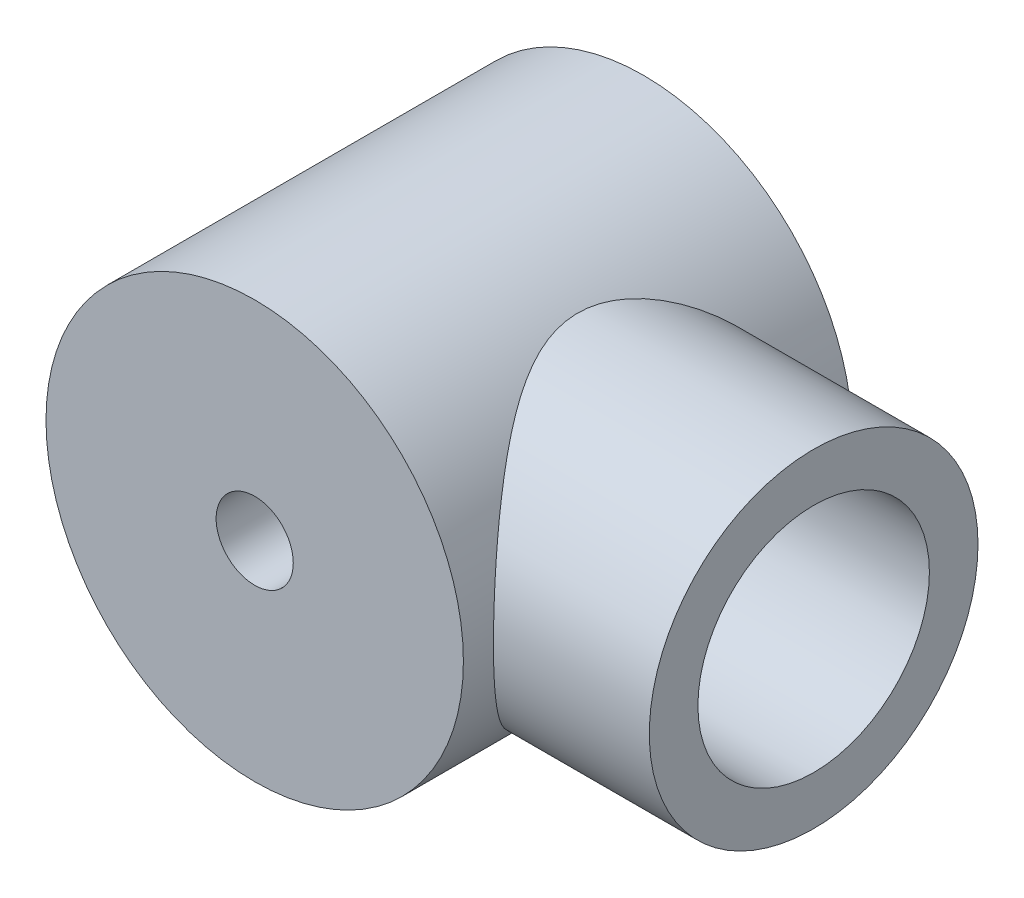
ISO-10303-21;
HEADER;
FILE_DESCRIPTION(('STEP AP214'),'2;1');
FILE_NAME('part.step','',(''),(''),'','','');
FILE_SCHEMA(('AUTOMOTIVE_DESIGN { 1 0 10303 214 1 1 1 1 }'));
ENDSEC;
DATA;
#1=APPLICATION_CONTEXT('core data for automotive mechanical design processes');
#2=APPLICATION_PROTOCOL_DEFINITION('international standard','automotive_design',2000,#1);
#3=PRODUCT_CONTEXT('',#1,'mechanical');
#4=PRODUCT('Part','Part','',(#3));
#5=PRODUCT_RELATED_PRODUCT_CATEGORY('part','',(#4));
#6=PRODUCT_DEFINITION_FORMATION('','',#4);
#7=PRODUCT_DEFINITION_CONTEXT('part definition',#1,'design');
#8=PRODUCT_DEFINITION('design','',#6,#7);
#9=PRODUCT_DEFINITION_SHAPE('','',#8);
#10=(LENGTH_UNIT() NAMED_UNIT(*) SI_UNIT(.MILLI.,.METRE.));
#11=(NAMED_UNIT(*) PLANE_ANGLE_UNIT() SI_UNIT($,.RADIAN.));
#12=(NAMED_UNIT(*) SI_UNIT($,.STERADIAN.) SOLID_ANGLE_UNIT());
#13=UNCERTAINTY_MEASURE_WITH_UNIT(LENGTH_MEASURE(1.E-05),#10,'distance_accuracy_value','');
#14=(GEOMETRIC_REPRESENTATION_CONTEXT(3) GLOBAL_UNCERTAINTY_ASSIGNED_CONTEXT((#13)) GLOBAL_UNIT_ASSIGNED_CONTEXT((#10,
#11,#12)) REPRESENTATION_CONTEXT('',''));
#15=CARTESIAN_POINT('',(0.,0.,0.));
#16=DIRECTION('',(0.,0.,1.));
#17=DIRECTION('',(1.,0.,0.));
#18=AXIS2_PLACEMENT_3D('',#15,#16,#17);
#19=CARTESIAN_POINT('',(0.,0.,-8.));
#20=DIRECTION('',(0.,0.,1.));
#21=DIRECTION('',(1.,0.,0.));
#22=AXIS2_PLACEMENT_3D('',#19,#20,#21);
#23=CYLINDRICAL_SURFACE('',#22,8.5875);
#24=CARTESIAN_POINT('',(0.,0.,-8.));
#25=DIRECTION('',(0.,0.,1.));
#26=DIRECTION('',(1.,0.,0.));
#27=AXIS2_PLACEMENT_3D('',#24,#25,#26);
#28=CIRCLE('',#27,8.5875);
#29=CARTESIAN_POINT('',(8.5875,0.,-8.));
#30=VERTEX_POINT('',#29);
#31=EDGE_CURVE('E60',#30,#30,#28,.T.);
#32=ORIENTED_EDGE('',*,*,#31,.T.);
#33=EDGE_LOOP('',(#32));
#34=FACE_BOUND('',#33,.T.);
#35=CARTESIAN_POINT('',(0.,0.,8.));
#36=DIRECTION('',(0.,0.,1.));
#37=DIRECTION('',(1.,0.,0.));
#38=AXIS2_PLACEMENT_3D('',#35,#36,#37);
#39=CIRCLE('',#38,8.5875);
#40=CARTESIAN_POINT('',(8.5875,0.,8.));
#41=VERTEX_POINT('',#40);
#42=EDGE_CURVE('E169',#41,#41,#39,.T.);
#43=ORIENTED_EDGE('',*,*,#42,.F.);
#44=EDGE_LOOP('',(#43));
#45=FACE_BOUND('',#44,.T.);
#46=CARTESIAN_POINT('',(8.5875,0.,-6.7625));
#47=CARTESIAN_POINT('',(8.58749913450199,-0.163112043237548,-6.76249910952128));
#48=CARTESIAN_POINT('',(8.58284258258308,-0.326238437681878,-6.75658867974146));
#49=CARTESIAN_POINT('',(8.56432259131237,-0.651182409785481,-6.73304710110437));
#50=CARTESIAN_POINT('',(8.55045475119252,-0.812999324408966,-6.71541034989741));
#51=CARTESIAN_POINT('',(8.51380874764045,-1.13418744062865,-6.66868800441926));
#52=CARTESIAN_POINT('',(8.49101751288267,-1.29355469632973,-6.63958561445441));
#53=CARTESIAN_POINT('',(8.43702860361331,-1.60849280329722,-6.57040096090926));
#54=CARTESIAN_POINT('',(8.40582727275956,-1.76406197116328,-6.53031392155735));
#55=CARTESIAN_POINT('',(8.33591220634313,-2.06931583900568,-6.44006929560211));
#56=CARTESIAN_POINT('',(8.29725059797367,-2.21903316951788,-6.38998150744619));
#57=CARTESIAN_POINT('',(8.21302251747412,-2.51293330241193,-6.28022442376314));
#58=CARTESIAN_POINT('',(8.16745303690808,-2.6571136589381,-6.22055095291227));
#59=CARTESIAN_POINT('',(8.02158741456264,-3.08027277844143,-6.02819761643001));
#60=CARTESIAN_POINT('',(7.91206355913889,-3.35016723252305,-5.88209506854118));
#61=CARTESIAN_POINT('',(7.71433048603765,-3.77758764946115,-5.61270919357559));
#62=CARTESIAN_POINT('',(7.63098149426175,-3.94284634797549,-5.49775829786058));
#63=CARTESIAN_POINT('',(7.45820615498423,-4.26063102760147,-5.25531493366235));
#64=CARTESIAN_POINT('',(7.36877792272126,-4.41315302696328,-5.1278185701452));
#65=CARTESIAN_POINT('',(7.18563635613676,-4.7054899836441,-4.8609739026031));
#66=CARTESIAN_POINT('',(7.09191234539941,-4.84527037732922,-4.72159523609139));
#67=CARTESIAN_POINT('',(6.90246867369577,-5.1115325682417,-4.43196691773817));
#68=CARTESIAN_POINT('',(6.80674922981725,-5.23801580314328,-4.28171844409973));
#69=CARTESIAN_POINT('',(6.61413580932432,-5.47928211289791,-3.96844269369884));
#70=CARTESIAN_POINT('',(6.51724513782237,-5.59386693254388,-3.80526061643791));
#71=CARTESIAN_POINT('',(6.32633100602854,-5.80890364550756,-3.46814629904978));
#72=CARTESIAN_POINT('',(6.23230842253847,-5.90935125019636,-3.29421081973044));
#73=CARTESIAN_POINT('',(6.05063469241563,-6.09522844309875,-2.93601324017483));
#74=CARTESIAN_POINT('',(5.96296614266829,-6.18070003711697,-2.75178199953865));
#75=CARTESIAN_POINT('',(5.79776234076226,-6.33592453104775,-2.37264327359999));
#76=CARTESIAN_POINT('',(5.7202185935303,-6.40569064448284,-2.17774493580585));
#77=CARTESIAN_POINT('',(5.56805556983659,-6.53864249117889,-1.74285354632197));
#78=CARTESIAN_POINT('',(5.49620272626052,-6.59866409433995,-1.50084750947978));
#79=CARTESIAN_POINT('',(5.4105948880383,-6.66873080663053,-1.12930679857006));
#80=CARTESIAN_POINT('',(5.38576278385851,-6.68875247562503,-1.0041188100111));
#81=CARTESIAN_POINT('',(5.34443531732408,-6.72182073077273,-0.751486869018815));
#82=CARTESIAN_POINT('',(5.32793598115201,-6.73487064186267,-0.624044021976135));
#83=CARTESIAN_POINT('',(5.30393293837296,-6.75379083176041,-0.366732311253095));
#84=CARTESIAN_POINT('',(5.29650288480873,-6.75960233399217,-0.23685216996732));
#85=CARTESIAN_POINT('',(5.29125602686978,-6.76371036137362,0.0232199075077388));
#86=CARTESIAN_POINT('',(5.29343884799235,-6.76200717928379,0.153411831352959));
#87=CARTESIAN_POINT('',(5.30731037568776,-6.75112498516842,0.413054510199779));
#88=CARTESIAN_POINT('',(5.3190054937024,-6.74194093090804,0.542504705983152));
#89=CARTESIAN_POINT('',(5.35133893095777,-6.71630467851747,0.799601895421015));
#90=CARTESIAN_POINT('',(5.37198198991186,-6.69984862832983,0.927247896341852));
#91=CARTESIAN_POINT('',(5.42563981758645,-6.65649889244587,1.20209737995963));
#92=CARTESIAN_POINT('',(5.46019229856917,-6.62827817049267,1.34879035453527));
#93=CARTESIAN_POINT('',(5.53862610496526,-6.56287866764632,1.63768018939204));
#94=CARTESIAN_POINT('',(5.58251445203624,-6.52569314135442,1.77987357246673));
#95=CARTESIAN_POINT('',(5.67786102727228,-6.44290620714456,2.0595347233208));
#96=CARTESIAN_POINT('',(5.72933618909827,-6.3972859134374,2.19699104859936));
#97=CARTESIAN_POINT('',(5.83804538473802,-6.29823725546676,2.46662519512575));
#98=CARTESIAN_POINT('',(5.89527789552865,-6.24481095448615,2.59880439950271));
#99=CARTESIAN_POINT('',(6.04091345101029,-6.1046561000265,2.9166662613854));
#100=CARTESIAN_POINT('',(6.1316896345411,-6.0138069999145,3.09945365588335));
#101=CARTESIAN_POINT('',(6.31840146450851,-5.81733228068011,3.45415362125783));
#102=CARTESIAN_POINT('',(6.41433926655664,-5.71170045799792,3.62606158237589));
#103=CARTESIAN_POINT('',(6.60837298467058,-5.48604889872762,3.95918952564848));
#104=CARTESIAN_POINT('',(6.70647112267585,-5.36601372405824,4.12039774682076));
#105=CARTESIAN_POINT('',(6.90209976532429,-5.11193566449544,4.43168981200543));
#106=CARTESIAN_POINT('',(6.99963035386763,-4.97789490858008,4.58177534085863));
#107=CARTESIAN_POINT('',(7.19378651286173,-4.69306961658929,4.87328081170988));
#108=CARTESIAN_POINT('',(7.2903530795989,-4.54199939829429,5.01446165842252));
#109=CARTESIAN_POINT('',(7.47820120108284,-4.22557891391568,5.28384866594572));
#110=CARTESIAN_POINT('',(7.56948200325979,-4.06022662270694,5.41205298113432));
#111=CARTESIAN_POINT('',(7.74426021947937,-3.716014395875,5.65391741826036));
#112=CARTESIAN_POINT('',(7.82777549034242,-3.53718725228571,5.76761114366387));
#113=CARTESIAN_POINT('',(7.98496765099718,-3.16637742545957,5.97921164617074));
#114=CARTESIAN_POINT('',(8.05864916244373,-2.97440098676011,6.07712584383352));
#115=CARTESIAN_POINT('',(8.17410611174868,-2.63648304633448,6.22928062038407));
#116=CARTESIAN_POINT('',(8.21890467421711,-2.49353353192052,6.28791189061201));
#117=CARTESIAN_POINT('',(8.30170203871326,-2.20222826409341,6.39575659142382));
#118=CARTESIAN_POINT('',(8.33970252226953,-2.0538738585574,6.44497235117671));
#119=CARTESIAN_POINT('',(8.40817909537395,-1.75257939027227,6.5333379655705));
#120=CARTESIAN_POINT('',(8.4386590856033,-1.59964175108543,6.57249303886158));
#121=CARTESIAN_POINT('',(8.49150164440413,-1.2900438124253,6.64020321678158));
#122=CARTESIAN_POINT('',(8.51386397981726,-1.13338340616296,6.66875801694598));
#123=CARTESIAN_POINT('',(8.55006443647259,-0.816737743924128,6.71491311634784));
#124=CARTESIAN_POINT('',(8.56386332421129,-0.656740606326983,6.73246300024504));
#125=CARTESIAN_POINT('',(8.58245777430414,-0.335377222676936,6.75609982955228));
#126=CARTESIAN_POINT('',(8.58725335785356,-0.174010979848032,6.76218680194792));
#127=CARTESIAN_POINT('',(8.58772806488527,0.148749773309905,6.76278960732639));
#128=CARTESIAN_POINT('',(8.58340753254853,0.3101442823417,6.75730587716365));
#129=CARTESIAN_POINT('',(8.56575242641335,0.631629417689947,6.73486545654116));
#130=CARTESIAN_POINT('',(8.55241819179976,0.791720092840154,6.71790919779167));
#131=CARTESIAN_POINT('',(8.5182745224411,1.09830553053107,6.67438526234607));
#132=CARTESIAN_POINT('',(8.49804793330376,1.2449729390842,6.64856608567238));
#133=CARTESIAN_POINT('',(8.45043720825167,1.53522065296745,6.58760211337653));
#134=CARTESIAN_POINT('',(8.42305064428142,1.67879989314281,6.55245415416189));
#135=CARTESIAN_POINT('',(8.36162306642033,1.96199032700115,6.47330001114597));
#136=CARTESIAN_POINT('',(8.32758359735308,2.10160243326037,6.42929588370192));
#137=CARTESIAN_POINT('',(8.2534029104338,2.37628897189325,6.33291840578578));
#138=CARTESIAN_POINT('',(8.21325933668777,2.51136162757173,6.28054182354264));
#139=CARTESIAN_POINT('',(8.12429519230187,2.78628346148602,6.1637619270824));
#140=CARTESIAN_POINT('',(8.07505096772139,2.92573866386686,6.098753286013));
#141=CARTESIAN_POINT('',(7.97103612853061,3.19828892611057,5.96034747207931));
#142=CARTESIAN_POINT('',(7.91626360383533,3.33138176414381,5.88694739871795));
#143=CARTESIAN_POINT('',(7.74484037278359,3.72059548587264,5.65506133671167));
#144=CARTESIAN_POINT('',(7.62104475367985,3.96676949520048,5.48483868342502));
#145=CARTESIAN_POINT('',(7.41355925446012,4.33700182872603,5.19163519312762));
#146=CARTESIAN_POINT('',(7.33379022247254,4.47032009622501,5.07722833477888));
#147=CARTESIAN_POINT('',(7.17121143490149,4.72672029341569,4.83942801088657));
#148=CARTESIAN_POINT('',(7.08840201003652,4.84980333171634,4.71603552132688));
#149=CARTESIAN_POINT('',(6.92104924798641,5.08578424713459,4.46055015015701));
#150=CARTESIAN_POINT('',(6.83650337339285,5.19866569172919,4.3284438042637));
#151=CARTESIAN_POINT('',(6.66735750184193,5.41389132685487,4.05602150558343));
#152=CARTESIAN_POINT('',(6.58275753046491,5.51623883931614,3.91570816294164));
#153=CARTESIAN_POINT('',(6.41660434495859,5.70860951497731,3.62938381976867));
#154=CARTESIAN_POINT('',(6.33502380577744,5.79881160831661,3.48350904340367));
#155=CARTESIAN_POINT('',(6.17531598327262,5.96860201450041,3.18384437713263));
#156=CARTESIAN_POINT('',(6.09718926315303,6.0481886005425,3.03005320510832));
#157=CARTESIAN_POINT('',(5.94678744291215,6.19612641245526,2.71471615601477));
#158=CARTESIAN_POINT('',(5.87450301323638,6.26449573852634,2.55318332623085));
#159=CARTESIAN_POINT('',(5.73841869209368,6.38938408059264,2.2222695828217));
#160=CARTESIAN_POINT('',(5.67461451966992,6.44590908414673,2.05289268767426));
#161=CARTESIAN_POINT('',(5.53790540676052,6.5641178597782,1.64425224119166));
#162=CARTESIAN_POINT('',(5.4698956666413,6.62042728790569,1.4016434376779));
#163=CARTESIAN_POINT('',(5.39067987179127,6.68482392386418,1.0297527566037));
#164=CARTESIAN_POINT('',(5.3680806317642,6.70294039202688,0.904531237091344));
#165=CARTESIAN_POINT('',(5.33135833952012,6.73218635528499,0.652065792014625));
#166=CARTESIAN_POINT('',(5.31723121989549,6.74331920328742,0.524822867081185));
#167=CARTESIAN_POINT('',(5.29804476466162,6.75840442048426,0.268325941076616));
#168=CARTESIAN_POINT('',(5.29304965856458,6.76230593109712,0.139064095825136));
#169=CARTESIAN_POINT('',(5.29257187894532,6.76267989854074,-0.119485837794347));
#170=CARTESIAN_POINT('',(5.29708896340842,6.759152544381,-0.248773925410993));
#171=CARTESIAN_POINT('',(5.31541549843665,6.74474963399044,-0.506375710360017));
#172=CARTESIAN_POINT('',(5.32923266479868,6.73386797624354,-0.634688509082128));
#173=CARTESIAN_POINT('',(5.3655139753675,6.70499430155844,-0.88932123233993));
#174=CARTESIAN_POINT('',(5.38798277265095,6.68699845828331,-1.01564004633512));
#175=CARTESIAN_POINT('',(5.44611233666464,6.63978126885757,-1.29158040838576));
#176=CARTESIAN_POINT('',(5.48354798495935,6.60900062951092,-1.44056054203455));
#177=CARTESIAN_POINT('',(5.56773548506076,6.53823324929153,-1.73368998028042));
#178=CARTESIAN_POINT('',(5.6144945972654,6.49823933002957,-1.87783541714749));
#179=CARTESIAN_POINT('',(5.71547288805906,6.40960564048464,-2.16112030710538));
#180=CARTESIAN_POINT('',(5.76970876694019,6.36094644216222,-2.30024764846762));
#181=CARTESIAN_POINT('',(5.88375900849463,6.25560276173973,-2.57297625230045));
#182=CARTESIAN_POINT('',(5.94357180445325,6.19892053123339,-2.70657905163874));
#183=CARTESIAN_POINT('',(6.09446222472643,6.05129549351649,-3.02594822667402));
#184=CARTESIAN_POINT('',(6.18771629533855,5.95625194691936,-3.2088000919301));
#185=CARTESIAN_POINT('',(6.37880338031622,5.75114777689259,-3.563379522074));
#186=CARTESIAN_POINT('',(6.47663821733447,5.64108114195035,-3.73510259298203));
#187=CARTESIAN_POINT('',(6.67388960414344,5.40628248230607,-4.0675496468049));
#188=CARTESIAN_POINT('',(6.77330760749722,5.28153621778691,-4.22826270652347));
#189=CARTESIAN_POINT('',(6.97099239015595,5.01772795868508,-4.53819509730367));
#190=CARTESIAN_POINT('',(7.06925934109318,4.87866812944487,-4.68741616091006));
#191=CARTESIAN_POINT('',(7.26382531913731,4.58406492257812,-4.97603655530657));
#192=CARTESIAN_POINT('',(7.36006889710434,4.42829623824863,-5.11524395399071));
#193=CARTESIAN_POINT('',(7.54661766696012,4.10231456535621,-5.38019811933773));
#194=CARTESIAN_POINT('',(7.63692194092399,3.93209935333658,-5.50594280720296));
#195=CARTESIAN_POINT('',(7.80905357483028,3.57805813794085,-5.74230859852382));
#196=CARTESIAN_POINT('',(7.89089922721514,3.39426304490388,-5.85296251008127));
#197=CARTESIAN_POINT('',(8.04398039713277,3.01356314009422,-6.05776327147086));
#198=CARTESIAN_POINT('',(8.11522173929703,2.8166656117473,-6.15191918823236));
#199=CARTESIAN_POINT('',(8.22471393198968,2.4740302378085,-6.2955221687647));
#200=CARTESIAN_POINT('',(8.26634380889814,2.33136573078659,-6.34977847434103));
#201=CARTESIAN_POINT('',(8.34276580881686,2.04105953626545,-6.44895280231337));
#202=CARTESIAN_POINT('',(8.37755966354332,1.89341912040561,-6.49387318987185));
#203=CARTESIAN_POINT('',(8.43960049773383,1.59423757144986,-6.57371556606062));
#204=CARTESIAN_POINT('',(8.46686276733827,1.44270503414929,-6.60865781659288));
#205=CARTESIAN_POINT('',(8.51337786735793,1.1364523861726,-6.66814797438525));
#206=CARTESIAN_POINT('',(8.53263394975727,0.981733596554878,-6.6927001020181));
#207=CARTESIAN_POINT('',(8.56088152002121,0.689411410463834,-6.72867366025587));
#208=CARTESIAN_POINT('',(8.57084699356979,0.552054098804223,-6.74134226553188));
#209=CARTESIAN_POINT('',(8.58415740670405,0.276468096828647,-6.75825683863165));
#210=CARTESIAN_POINT('',(8.58750073351882,0.138239202466487,-6.76250075469024));
#211=CARTESIAN_POINT('',(8.5875,0.,-6.7625));
#212=B_SPLINE_CURVE_WITH_KNOTS('',3,(#46,#47,#48,#49,#50,#51,#52,#53,#54,#55,#56,#57,#58,#59,
#60,#61,#62,#63,#64,#65,#66,#67,#68,#69,#70,#71,#72,#73,#74,#75,#76,#77,#78,#79,#80,#81,#82,#83,
#84,#85,#86,#87,#88,#89,#90,#91,#92,#93,#94,#95,#96,#97,#98,#99,#100,#101,#102,#103,#104,#105,
#106,#107,#108,#109,#110,#111,#112,#113,#114,#115,#116,#117,#118,#119,#120,#121,#122,#123,#124,
#125,#126,#127,#128,#129,#130,#131,#132,#133,#134,#135,#136,#137,#138,#139,#140,#141,#142,#143,
#144,#145,#146,#147,#148,#149,#150,#151,#152,#153,#154,#155,#156,#157,#158,#159,#160,#161,#162,
#163,#164,#165,#166,#167,#168,#169,#170,#171,#172,#173,#174,#175,#176,#177,#178,#179,#180,#181,
#182,#183,#184,#185,#186,#187,#188,#189,#190,#191,#192,#193,#194,#195,#196,#197,#198,#199,#200,
#201,#202,#203,#204,#205,#206,#207,#208,#209,#210,#211),.UNSPECIFIED.,.T.,.F.,(4,2,2,2,2,2,2,2,
2,2,2,2,2,2,2,2,2,2,2,2,2,2,2,2,2,2,2,2,2,2,2,2,2,2,2,2,2,2,2,2,2,2,2,2,2,2,2,2,2,2,2,2,2,2,2,2,
2,2,2,2,2,2,2,2,2,2,2,2,2,2,2,2,2,2,2,2,2,2,2,2,2,2,4),(0.,0.489189244579093,0.978612371576191,
1.46875512258399,1.95911131090346,2.4461577895962,2.9334169937366,3.90698924993781,
4.55991560905964,5.21304532793188,5.86789708696919,6.52267797118023,7.18703871578309,
7.85160056673394,8.51426748050667,9.17637477028301,9.95167748151299,10.3388454434372,
10.7258285938997,11.1159340212858,11.5060242509029,11.8963776257358,12.2869380234357,
12.7462164568928,13.205841550304,13.6665085075091,14.1270539208252,14.7962817615387,
15.4657912901519,16.1360249455138,16.8061568669644,17.4899530318968,18.1738463153133,
18.856125943386,19.5380837770198,20.0202357785508,20.5022683527007,20.9840503812197,
21.4658462465703,21.9498334756385,22.4338195653193,22.9177873823257,23.4017369886777,
23.8521085750988,24.3026330878711,24.7530531115835,25.2036474193235,25.6878151059947,
26.1721506540204,27.1404225000776,27.7188390446972,28.2971928574281,28.8764622578647,
29.4555484193368,30.0248558550038,30.5942557860753,31.1627276981351,31.7309115384446,
32.5021301047279,32.8873125880384,33.2723099994994,33.6600050020453,34.0476901407483,
34.4356973188671,34.8239134696781,35.293187153706,35.762827709368,36.2335347953209,
36.7041100424073,37.3817454636999,38.0596528412059,38.7382233220416,39.416691299832,
40.1058555960634,40.7951261541909,41.4828734655536,42.1702416126955,42.6444191801153,
43.1184764725122,43.5915641711839,44.0644595210896,44.4789517079129,44.8935448285896),.UNSPECIFIED.);
#213=CARTESIAN_POINT('',(8.5875,0.,-6.7625));
#214=VERTEX_POINT('',#213);
#215=EDGE_CURVE('E79',#214,#214,#212,.T.);
#216=ORIENTED_EDGE('',*,*,#215,.T.);
#217=EDGE_LOOP('',(#216));
#218=FACE_BOUND('',#217,.T.);
#219=ADVANCED_FACE('F55',(#34,#45,#218),#23,.T.);
#220=CARTESIAN_POINT('',(0.,0.,-8.));
#221=DIRECTION('',(0.,0.,1.));
#222=DIRECTION('',(1.,0.,0.));
#223=AXIS2_PLACEMENT_3D('',#220,#221,#222);
#224=CYLINDRICAL_SURFACE('',#223,1.5875);
#225=CARTESIAN_POINT('',(0.,0.,-8.));
#226=DIRECTION('',(0.,0.,1.));
#227=DIRECTION('',(1.,0.,0.));
#228=AXIS2_PLACEMENT_3D('',#225,#226,#227);
#229=CIRCLE('',#228,1.5875);
#230=CARTESIAN_POINT('',(1.5875,0.,-8.));
#231=VERTEX_POINT('',#230);
#232=EDGE_CURVE('E70',#231,#231,#229,.T.);
#233=ORIENTED_EDGE('',*,*,#232,.F.);
#234=EDGE_LOOP('',(#233));
#235=FACE_BOUND('',#234,.T.);
#236=CARTESIAN_POINT('',(0.,0.,8.));
#237=DIRECTION('',(0.,0.,1.));
#238=DIRECTION('',(1.,0.,0.));
#239=AXIS2_PLACEMENT_3D('',#236,#237,#238);
#240=CIRCLE('',#239,1.5875);
#241=CARTESIAN_POINT('',(1.5875,0.,8.));
#242=VERTEX_POINT('',#241);
#243=EDGE_CURVE('E173',#242,#242,#240,.T.);
#244=ORIENTED_EDGE('',*,*,#243,.T.);
#245=EDGE_LOOP('',(#244));
#246=FACE_BOUND('',#245,.T.);
#247=ADVANCED_FACE('F102',(#235,#246),#224,.F.);
#248=CARTESIAN_POINT('',(0.,0.,-8.));
#249=DIRECTION('',(0.,0.,1.));
#250=DIRECTION('',(1.,0.,0.));
#251=AXIS2_PLACEMENT_3D('',#248,#249,#250);
#252=PLANE('',#251);
#253=ORIENTED_EDGE('',*,*,#232,.T.);
#254=EDGE_LOOP('',(#253));
#255=FACE_BOUND('',#254,.T.);
#256=ORIENTED_EDGE('',*,*,#31,.F.);
#257=EDGE_LOOP('',(#256));
#258=FACE_BOUND('',#257,.T.);
#259=ADVANCED_FACE('F100',(#255,#258),#252,.F.);
#260=CARTESIAN_POINT('',(0.,0.,8.));
#261=DIRECTION('',(0.,0.,1.));
#262=DIRECTION('',(1.,0.,0.));
#263=AXIS2_PLACEMENT_3D('',#260,#261,#262);
#264=PLANE('',#263);
#265=ORIENTED_EDGE('',*,*,#42,.T.);
#266=EDGE_LOOP('',(#265));
#267=FACE_BOUND('',#266,.T.);
#268=ORIENTED_EDGE('',*,*,#243,.F.);
#269=EDGE_LOOP('',(#268));
#270=FACE_BOUND('',#269,.T.);
#271=ADVANCED_FACE('F92',(#267,#270),#264,.T.);
#272=CARTESIAN_POINT('',(15.,0.,0.));
#273=DIRECTION('',(1.,0.,0.));
#274=DIRECTION('',(0.,0.,-1.));
#275=AXIS2_PLACEMENT_3D('',#272,#273,#274);
#276=PLANE('',#275);
#277=CARTESIAN_POINT('',(15.,0.,0.));
#278=DIRECTION('',(1.,0.,0.));
#279=DIRECTION('',(0.,0.,-1.));
#280=AXIS2_PLACEMENT_3D('',#277,#278,#279);
#281=CIRCLE('',#280,6.7625);
#282=CARTESIAN_POINT('',(15.,0.,-6.7625));
#283=VERTEX_POINT('',#282);
#284=EDGE_CURVE('E77',#283,#283,#281,.T.);
#285=ORIENTED_EDGE('',*,*,#284,.T.);
#286=EDGE_LOOP('',(#285));
#287=FACE_BOUND('',#286,.T.);
#288=CARTESIAN_POINT('',(15.,0.,0.));
#289=DIRECTION('',(1.,0.,0.));
#290=DIRECTION('',(0.,0.,-1.));
#291=AXIS2_PLACEMENT_3D('',#288,#289,#290);
#292=CIRCLE('',#291,4.7625);
#293=CARTESIAN_POINT('',(15.,0.,-4.7625));
#294=VERTEX_POINT('',#293);
#295=EDGE_CURVE('E178',#294,#294,#292,.T.);
#296=ORIENTED_EDGE('',*,*,#295,.F.);
#297=EDGE_LOOP('',(#296));
#298=FACE_BOUND('',#297,.T.);
#299=ADVANCED_FACE('F90',(#287,#298),#276,.T.);
#300=CARTESIAN_POINT('',(15.,0.,0.));
#301=DIRECTION('',(-1.,0.,0.));
#302=DIRECTION('',(0.,0.,1.));
#303=AXIS2_PLACEMENT_3D('',#300,#301,#302);
#304=CYLINDRICAL_SURFACE('',#303,6.7625);
#305=ORIENTED_EDGE('',*,*,#215,.F.);
#306=EDGE_LOOP('',(#305));
#307=FACE_BOUND('',#306,.T.);
#308=ORIENTED_EDGE('',*,*,#284,.F.);
#309=EDGE_LOOP('',(#308));
#310=FACE_BOUND('',#309,.T.);
#311=ADVANCED_FACE('F89',(#307,#310),#304,.T.);
#312=CARTESIAN_POINT('',(15.,0.,0.));
#313=DIRECTION('',(-1.,0.,0.));
#314=DIRECTION('',(0.,0.,1.));
#315=AXIS2_PLACEMENT_3D('',#312,#313,#314);
#316=CYLINDRICAL_SURFACE('',#315,4.7625);
#317=CARTESIAN_POINT('',(8.5875,0.,-4.7625));
#318=CARTESIAN_POINT('',(8.58750136624759,-0.123540662729897,-4.76250153706124));
#319=CARTESIAN_POINT('',(8.5848290668004,-0.247063815025433,-4.75768870660874));
#320=CARTESIAN_POINT('',(8.57421128964902,-0.493178741735023,-4.73850347528329));
#321=CARTESIAN_POINT('',(8.56626432944852,-0.615770244499117,-4.72412838683928));
#322=CARTESIAN_POINT('',(8.54528833733139,-0.859150223121152,-4.68598503648981));
#323=CARTESIAN_POINT('',(8.53225468219542,-0.97993695466138,-4.66220822924598));
#324=CARTESIAN_POINT('',(8.50142584201441,-1.21877921714014,-4.60554620212321));
#325=CARTESIAN_POINT('',(8.48362871274451,-1.33683361144407,-4.57265726290995));
#326=CARTESIAN_POINT('',(8.44379173907492,-1.56886117286086,-4.49831639834476));
#327=CARTESIAN_POINT('',(8.42177181356869,-1.68285063313127,-4.45690461060071));
#328=CARTESIAN_POINT('',(8.3739379354894,-1.9066840225184,-4.3658424654971));
#329=CARTESIAN_POINT('',(8.3481225472735,-2.01652636313106,-4.31618898977881));
#330=CARTESIAN_POINT('',(8.26582710402402,-2.33886678002069,-4.15555767393931));
#331=CARTESIAN_POINT('',(8.20445776783941,-2.54440166346567,-4.03283648633992));
#332=CARTESIAN_POINT('',(8.06913589158275,-2.9465900913618,-3.75015256897967));
#333=CARTESIAN_POINT('',(7.9946051697665,-3.14163287396523,-3.58819393600173));
#334=CARTESIAN_POINT('',(7.84285627377938,-3.50332311559721,-3.23604119115127));
#335=CARTESIAN_POINT('',(7.76563562626801,-3.66994356397729,-3.04582053857853));
#336=CARTESIAN_POINT('',(7.60808766181872,-3.98704947352266,-2.61957460330507));
#337=CARTESIAN_POINT('',(7.52822914360619,-4.13422617956411,-2.38086658001207));
#338=CARTESIAN_POINT('',(7.42049252494249,-4.3228138019861,-2.00362344505267));
#339=CARTESIAN_POINT('',(7.38657966137506,-4.38032707544095,-1.87463322904761));
#340=CARTESIAN_POINT('',(7.3241071860546,-4.48400129670014,-1.61095245410247));
#341=CARTESIAN_POINT('',(7.2955440841782,-4.53016965197688,-1.47626568233971));
#342=CARTESIAN_POINT('',(7.24663153859961,-4.60797902368908,-1.21072945715671));
#343=CARTESIAN_POINT('',(7.22587988088969,-4.64034847403472,-1.08016751114982));
#344=CARTESIAN_POINT('',(7.19113508341906,-4.69401302174334,-0.815965522820267));
#345=CARTESIAN_POINT('',(7.17713791101275,-4.715314727491,-0.682327367155135));
#346=CARTESIAN_POINT('',(7.15657645216841,-4.74646404547198,-0.413285461803441));
#347=CARTESIAN_POINT('',(7.15000473314203,-4.75632311160914,-0.277883615110478));
#348=CARTESIAN_POINT('',(7.14460699080766,-4.76442794524967,-0.00658837758861104));
#349=CARTESIAN_POINT('',(7.14577987168481,-4.76267535573318,0.129304940980504));
#350=CARTESIAN_POINT('',(7.15502277962899,-4.74877422437525,0.379023417739793));
#351=CARTESIAN_POINT('',(7.16198905285236,-4.73828898089656,0.492986190867628));
#352=CARTESIAN_POINT('',(7.18112737497093,-4.70923112429649,0.71944478579291));
#353=CARTESIAN_POINT('',(7.19330100260904,-4.69065605850718,0.831940152041095));
#354=CARTESIAN_POINT('',(7.23705234837445,-4.62311498653135,1.16608046294158));
#355=CARTESIAN_POINT('',(7.27586624342261,-4.56232529501711,1.38451375897434));
#356=CARTESIAN_POINT('',(7.36905011105366,-4.41024675988994,1.81214141595742));
#357=CARTESIAN_POINT('',(7.42373300895122,-4.31833748935018,2.0210409656501));
#358=CARTESIAN_POINT('',(7.5426231857091,-4.10714809033425,2.42157287678296));
#359=CARTESIAN_POINT('',(7.60683453057146,-3.98785626516509,2.61319781036525));
#360=CARTESIAN_POINT('',(7.74995407890935,-3.7030621785492,3.006118562774));
#361=CARTESIAN_POINT('',(7.82956484279359,-3.53321323214197,3.20401115183112));
#362=CARTESIAN_POINT('',(7.9863992325728,-3.16274862973515,3.57018397727733));
#363=CARTESIAN_POINT('',(8.06362114329999,-2.96211145719911,3.73844332630599));
#364=CARTESIAN_POINT('',(8.17464385436158,-2.63344812587389,3.97065077480336));
#365=CARTESIAN_POINT('',(8.2119463248493,-2.51500784829611,4.04673672026047));
#366=CARTESIAN_POINT('',(8.28273931046276,-2.27101041524183,4.18853220066486));
#367=CARTESIAN_POINT('',(8.31623145393023,-2.14545633447093,4.25424617275665));
#368=CARTESIAN_POINT('',(8.3784169290999,-1.88807070616978,4.37455934275679));
#369=CARTESIAN_POINT('',(8.40711271185005,-1.75624240942903,4.42916422077904));
#370=CARTESIAN_POINT('',(8.45884506053156,-1.48722694052792,4.52658988364433));
#371=CARTESIAN_POINT('',(8.48188244616244,-1.35004054790535,4.56941237544226));
#372=CARTESIAN_POINT('',(8.51968810858967,-1.08458408541675,4.6391928502019));
#373=CARTESIAN_POINT('',(8.53502999133984,-0.956687495089182,4.66726345567216));
#374=CARTESIAN_POINT('',(8.56002903320478,-0.698480758953909,4.71282412665362));
#375=CARTESIAN_POINT('',(8.56968685921998,-0.56817089814224,4.73031543342211));
#376=CARTESIAN_POINT('',(8.58303596240136,-0.306314561016899,4.75445658218817));
#377=CARTESIAN_POINT('',(8.58673034544723,-0.174768764335044,4.76111206771248));
#378=CARTESIAN_POINT('',(8.58805273326348,0.0884484319938167,4.76349678518266));
#379=CARTESIAN_POINT('',(8.58568114406697,0.220119822644303,4.7592267484414));
#380=CARTESIAN_POINT('',(8.57548224670657,0.46927609474965,4.74080115879345));
#381=CARTESIAN_POINT('',(8.56822445592111,0.586862442709509,4.72767727366646));
#382=CARTESIAN_POINT('',(8.54902565926909,0.820394994931048,4.69279253977324));
#383=CARTESIAN_POINT('',(8.53708320257958,0.936340679549277,4.67102901531898));
#384=CARTESIAN_POINT('',(8.50879108657965,1.1657522600104,4.61911793072229));
#385=CARTESIAN_POINT('',(8.49244283114076,1.27921893334073,4.58897304113614));
#386=CARTESIAN_POINT('',(8.45570327948678,1.50304065830958,4.52061841957201));
#387=CARTESIAN_POINT('',(8.43531042224729,1.61339448969653,4.48240557337699));
#388=CARTESIAN_POINT('',(8.36774195407376,1.94345869743708,4.35439351000889));
#389=CARTESIAN_POINT('',(8.31479053510796,2.15737721408968,4.25231356422446));
#390=CARTESIAN_POINT('',(8.19809292332133,2.56547203334984,4.01934407477641));
#391=CARTESIAN_POINT('',(8.13434286717948,2.75964123051039,3.88844421545711));
#392=CARTESIAN_POINT('',(7.99330871428637,3.14628379503722,3.58459764224653));
#393=CARTESIAN_POINT('',(7.91530934340972,3.33608369206208,3.40857041235044));
#394=CARTESIAN_POINT('',(7.75907628039874,3.68490345290034,3.02814962643646));
#395=CARTESIAN_POINT('',(7.68084242708293,3.84389027572443,2.82372601956355));
#396=CARTESIAN_POINT('',(7.5260572779972,4.13927924259841,2.37194842063636));
#397=CARTESIAN_POINT('',(7.45015032249566,4.27282657036672,2.12246190656135));
#398=CARTESIAN_POINT('',(7.35135335389961,4.43924888144807,1.73051243076991));
#399=CARTESIAN_POINT('',(7.32093333399797,4.48907072668797,1.5969200594317));
#400=CARTESIAN_POINT('',(7.26639805710805,4.57682072911148,1.32459275508252));
#401=CARTESIAN_POINT('',(7.24228160872218,4.61475113409054,1.18585879951725));
#402=CARTESIAN_POINT('',(7.20352030054756,4.67499832708322,0.918035360380329));
#403=CARTESIAN_POINT('',(7.18818701389532,4.69846688506215,0.789303553126146));
#404=CARTESIAN_POINT('',(7.16433354655907,4.73476048367148,0.529728824451591));
#405=CARTESIAN_POINT('',(7.15581222850352,4.74758730113111,0.398886259180796));
#406=CARTESIAN_POINT('',(7.14598993443779,4.76235906519753,0.136412832171398));
#407=CARTESIAN_POINT('',(7.14468366731813,4.76431198611234,0.00478261898642908));
#408=CARTESIAN_POINT('',(7.14934111193058,4.75732025993159,-0.258050010232938));
#409=CARTESIAN_POINT('',(7.1553041868062,4.74837656747257,-0.38925246273318));
#410=CARTESIAN_POINT('',(7.17287880612158,4.72177681706349,-0.631609483566777));
#411=CARTESIAN_POINT('',(7.18357771154315,4.70552341489809,-0.742987783336697));
#412=CARTESIAN_POINT('',(7.2097565799233,4.66531181863331,-0.963784619461231));
#413=CARTESIAN_POINT('',(7.22523796221863,4.64135133715062,-1.07320256381154));
#414=CARTESIAN_POINT('',(7.27814873198192,4.55829717018313,-1.39751638641542));
#415=CARTESIAN_POINT('',(7.32205492354706,4.48801632231451,-1.60860038924542));
#416=CARTESIAN_POINT('',(7.42527656308573,4.31521401399975,-2.02856193741922));
#417=CARTESIAN_POINT('',(7.48535985559997,4.21100795447503,-2.23654351718243));
#418=CARTESIAN_POINT('',(7.61339071878975,3.97485523061696,-2.6334943603424));
#419=CARTESIAN_POINT('',(7.68134242000931,3.84289396616317,-2.82245353969082));
#420=CARTESIAN_POINT('',(7.83044989594184,3.53040790302892,-3.20758875692344));
#421=CARTESIAN_POINT('',(7.91197626097728,3.3454893096614,-3.40006658278203));
#422=CARTESIAN_POINT('',(8.0697703433511,2.94453456232952,-3.75264091424402));
#423=CARTESIAN_POINT('',(8.14603414639551,2.7284756073478,-3.91271348434769));
#424=CARTESIAN_POINT('',(8.2520498799888,2.38000483067563,-4.12754342047428));
#425=CARTESIAN_POINT('',(8.2865469058704,2.25726603090946,-4.19595429669132));
#426=CARTESIAN_POINT('',(8.35109562207614,2.00530081879664,-4.3220354237203));
#427=CARTESIAN_POINT('',(8.38114948795087,1.87607762326639,-4.37971093460802));
#428=CARTESIAN_POINT('',(8.43586790616153,1.61226740203457,-4.48353192823159));
#429=CARTESIAN_POINT('',(8.46054256929939,1.47769101146714,-4.5296990660723));
#430=CARTESIAN_POINT('',(8.50379125341409,1.20409998745815,-4.60997390659743));
#431=CARTESIAN_POINT('',(8.52236841258075,1.06508767759206,-4.64408781338692));
#432=CARTESIAN_POINT('',(8.55400394463343,0.772914235497976,-4.70190045971597));
#433=CARTESIAN_POINT('',(8.5665223880444,0.619492080669483,-4.72458592212));
#434=CARTESIAN_POINT('',(8.58326945354422,0.310704023457541,-4.75488453822636));
#435=CARTESIAN_POINT('',(8.58749828210084,0.155338169582415,-4.76249806732234));
#436=CARTESIAN_POINT('',(8.5875,0.,-4.7625));
#437=B_SPLINE_CURVE_WITH_KNOTS('',3,(#317,#318,#319,#320,#321,#322,#323,#324,#325,#326,#327,
#328,#329,#330,#331,#332,#333,#334,#335,#336,#337,#338,#339,#340,#341,#342,#343,#344,#345,#346,
#347,#348,#349,#350,#351,#352,#353,#354,#355,#356,#357,#358,#359,#360,#361,#362,#363,#364,#365,
#366,#367,#368,#369,#370,#371,#372,#373,#374,#375,#376,#377,#378,#379,#380,#381,#382,#383,#384,
#385,#386,#387,#388,#389,#390,#391,#392,#393,#394,#395,#396,#397,#398,#399,#400,#401,#402,#403,
#404,#405,#406,#407,#408,#409,#410,#411,#412,#413,#414,#415,#416,#417,#418,#419,#420,#421,#422,
#423,#424,#425,#426,#427,#428,#429,#430,#431,#432,#433,#434,#435,#436),.UNSPECIFIED.,.T.,.F.,(4,
2,2,2,2,2,2,2,2,2,2,2,2,2,2,2,2,2,2,2,2,2,2,2,2,2,2,2,2,2,2,2,2,2,2,2,2,2,2,2,2,2,2,2,2,2,2,2,2,
2,2,2,2,2,2,2,2,2,2,4),(0.,0.370470046793782,0.741044262028311,1.11195607383622,
1.48301950577217,1.85237387197696,2.22186830851138,2.96015053607059,3.74975764783029,
4.54011101763388,5.40996305744714,5.84517590070114,6.28010381949041,6.68780797514852,
7.09526841619185,7.50232064296155,7.90931527549466,8.25286044757009,8.59650984806975,
9.2834102689086,9.98490167146554,10.6866932815534,11.5013806682007,12.3166400189948,
12.7530382798359,13.1892493399028,13.6252368002505,14.0611610642952,14.4561230493927,
14.8510386850484,15.2457485743479,15.640432043961,15.9956318861233,16.3509418192643,
16.7061386694076,17.061472876393,17.7868388401686,18.5124648611313,19.3201263364022,
20.1286491360509,21.0023666330277,21.4391595344064,21.8758698205695,22.2705284031649,
22.6651210771705,23.0594243408116,23.4536930625981,23.7924961722408,24.1313999281484,
24.8088239386502,25.5269837235465,26.2455222323964,27.0792365713595,27.9135644879234,
28.347120856186,28.7804642296095,29.2129859263645,29.6452846677371,30.111119730268,
30.5769431901913),.UNSPECIFIED.);
#438=CARTESIAN_POINT('',(8.5875,0.,-4.7625));
#439=VERTEX_POINT('',#438);
#440=EDGE_CURVE('E11',#439,#439,#437,.T.);
#441=ORIENTED_EDGE('',*,*,#440,.T.);
#442=EDGE_LOOP('',(#441));
#443=FACE_BOUND('',#442,.T.);
#444=ORIENTED_EDGE('',*,*,#295,.T.);
#445=EDGE_LOOP('',(#444));
#446=FACE_BOUND('',#445,.T.);
#447=ADVANCED_FACE('F85',(#443,#446),#316,.F.);
#448=ORIENTED_EDGE('',*,*,#440,.F.);
#449=EDGE_LOOP('',(#448));
#450=FACE_BOUND('',#449,.T.);
#451=ADVANCED_FACE('F57',(#450),#23,.T.);
#452=CLOSED_SHELL('',(#219,#247,#259,#271,#299,#311,#447,#451));
#453=MANIFOLD_SOLID_BREP('B2',#452);
#454=ADVANCED_BREP_SHAPE_REPRESENTATION('',(#18,#453),#14);
#455=SHAPE_DEFINITION_REPRESENTATION(#9,#454);
ENDSEC;
END-ISO-10303-21;
